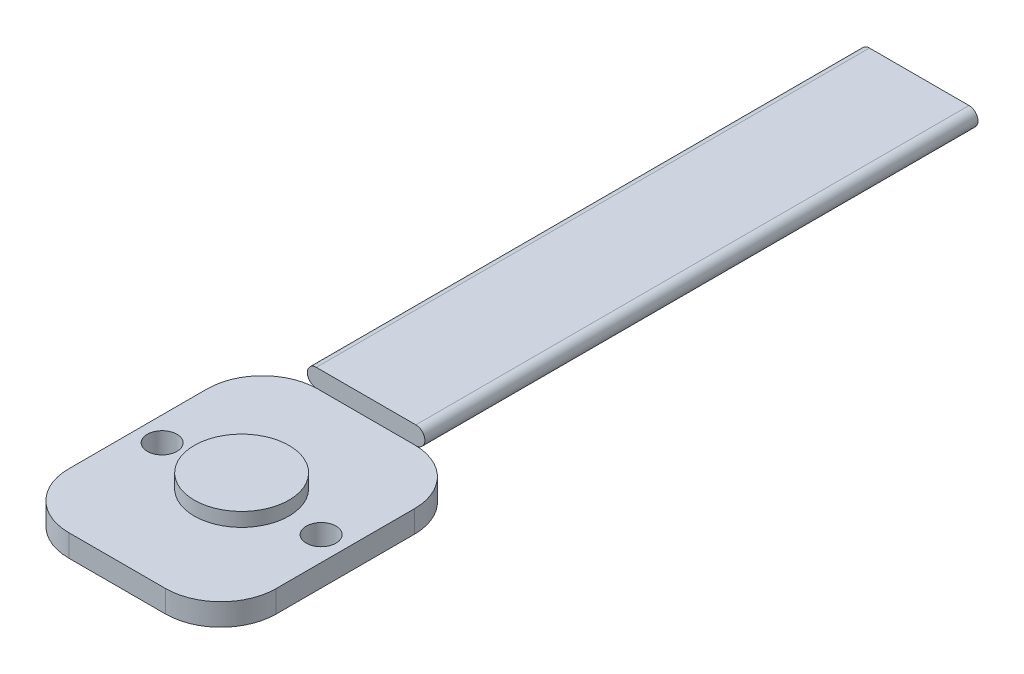
ISO-10303-21;
HEADER;
FILE_DESCRIPTION(('STEP AP214'),'2;1');
FILE_NAME('part.step','',(''),(''),'','','');
FILE_SCHEMA(('AUTOMOTIVE_DESIGN { 1 0 10303 214 1 1 1 1 }'));
ENDSEC;
DATA;
#1=APPLICATION_CONTEXT('core data for automotive mechanical design processes');
#2=APPLICATION_PROTOCOL_DEFINITION('international standard','automotive_design',2000,#1);
#3=PRODUCT_CONTEXT('',#1,'mechanical');
#4=PRODUCT('Part','Part','',(#3));
#5=PRODUCT_RELATED_PRODUCT_CATEGORY('part','',(#4));
#6=PRODUCT_DEFINITION_FORMATION('','',#4);
#7=PRODUCT_DEFINITION_CONTEXT('part definition',#1,'design');
#8=PRODUCT_DEFINITION('design','',#6,#7);
#9=PRODUCT_DEFINITION_SHAPE('','',#8);
#10=(LENGTH_UNIT() NAMED_UNIT(*) SI_UNIT(.MILLI.,.METRE.));
#11=(NAMED_UNIT(*) PLANE_ANGLE_UNIT() SI_UNIT($,.RADIAN.));
#12=(NAMED_UNIT(*) SI_UNIT($,.STERADIAN.) SOLID_ANGLE_UNIT());
#13=UNCERTAINTY_MEASURE_WITH_UNIT(LENGTH_MEASURE(1.E-05),#10,'distance_accuracy_value','');
#14=(GEOMETRIC_REPRESENTATION_CONTEXT(3) GLOBAL_UNCERTAINTY_ASSIGNED_CONTEXT((#13)) GLOBAL_UNIT_ASSIGNED_CONTEXT((#10,
#11,#12)) REPRESENTATION_CONTEXT('',''));
#15=CARTESIAN_POINT('',(0.,0.,0.));
#16=DIRECTION('',(0.,0.,1.));
#17=DIRECTION('',(1.,0.,0.));
#18=AXIS2_PLACEMENT_3D('',#15,#16,#17);
#19=CARTESIAN_POINT('',(-3.6,2.25,-49.));
#20=DIRECTION('',(0.,0.,1.));
#21=DIRECTION('',(1.,0.,0.));
#22=AXIS2_PLACEMENT_3D('',#19,#20,#21);
#23=CYLINDRICAL_SURFACE('',#22,0.65);
#24=CARTESIAN_POINT('',(-3.6,2.25,-9.));
#25=DIRECTION('',(0.,0.,-1.));
#26=DIRECTION('',(-1.,0.,0.));
#27=AXIS2_PLACEMENT_3D('',#24,#25,#26);
#28=CIRCLE('',#27,0.65);
#29=CARTESIAN_POINT('',(-3.6,1.6,-9.));
#30=VERTEX_POINT('',#29);
#31=CARTESIAN_POINT('',(-3.6,2.9,-9.));
#32=VERTEX_POINT('',#31);
#33=EDGE_CURVE('E112',#30,#32,#28,.T.);
#34=ORIENTED_EDGE('',*,*,#33,.T.);
#35=DIRECTION('',(0.,0.,1.));
#36=VECTOR('',#35,1.);
#37=CARTESIAN_POINT('',(-3.6,2.9,-49.));
#38=LINE('',#37,#36);
#39=CARTESIAN_POINT('',(-3.6,2.9,-49.));
#40=VERTEX_POINT('',#39);
#41=EDGE_CURVE('E12',#40,#32,#38,.T.);
#42=ORIENTED_EDGE('',*,*,#41,.F.);
#43=CARTESIAN_POINT('',(-3.6,2.25,-49.));
#44=DIRECTION('',(0.,0.,-1.));
#45=DIRECTION('',(-1.,0.,0.));
#46=AXIS2_PLACEMENT_3D('',#43,#44,#45);
#47=CIRCLE('',#46,0.65);
#48=CARTESIAN_POINT('',(-3.6,1.6,-49.));
#49=VERTEX_POINT('',#48);
#50=EDGE_CURVE('E100',#49,#40,#47,.T.);
#51=ORIENTED_EDGE('',*,*,#50,.F.);
#52=DIRECTION('',(0.,0.,1.));
#53=VECTOR('',#52,1.);
#54=CARTESIAN_POINT('',(-3.6,1.6,-49.));
#55=LINE('',#54,#53);
#56=EDGE_CURVE('E108',#49,#30,#55,.T.);
#57=ORIENTED_EDGE('',*,*,#56,.T.);
#58=EDGE_LOOP('',(#34,#42,#51,#57));
#59=FACE_BOUND('',#58,.T.);
#60=ADVANCED_FACE('F49',(#59),#23,.T.);
#61=CARTESIAN_POINT('',(-3.6,2.9,-49.));
#62=DIRECTION('',(0.,-1.,0.));
#63=DIRECTION('',(0.,0.,-1.));
#64=AXIS2_PLACEMENT_3D('',#61,#62,#63);
#65=PLANE('',#64);
#66=DIRECTION('',(1.,0.,0.));
#67=VECTOR('',#66,1.);
#68=CARTESIAN_POINT('',(-3.6,2.9,-9.));
#69=LINE('',#68,#67);
#70=CARTESIAN_POINT('',(3.6,2.9,-9.));
#71=VERTEX_POINT('',#70);
#72=EDGE_CURVE('E104',#32,#71,#69,.T.);
#73=ORIENTED_EDGE('',*,*,#72,.T.);
#74=DIRECTION('',(0.,0.,1.));
#75=VECTOR('',#74,1.);
#76=CARTESIAN_POINT('',(3.6,2.9,-49.));
#77=LINE('',#76,#75);
#78=CARTESIAN_POINT('',(3.6,2.9,-49.));
#79=VERTEX_POINT('',#78);
#80=EDGE_CURVE('E57',#79,#71,#77,.T.);
#81=ORIENTED_EDGE('',*,*,#80,.F.);
#82=DIRECTION('',(1.,0.,0.));
#83=VECTOR('',#82,1.);
#84=CARTESIAN_POINT('',(-3.6,2.9,-49.));
#85=LINE('',#84,#83);
#86=EDGE_CURVE('E95',#40,#79,#85,.T.);
#87=ORIENTED_EDGE('',*,*,#86,.F.);
#88=ORIENTED_EDGE('',*,*,#41,.T.);
#89=EDGE_LOOP('',(#73,#81,#87,#88));
#90=FACE_BOUND('',#89,.T.);
#91=ADVANCED_FACE('F103',(#90),#65,.F.);
#92=CARTESIAN_POINT('',(3.6,2.25,-49.));
#93=DIRECTION('',(0.,0.,1.));
#94=DIRECTION('',(1.,0.,0.));
#95=AXIS2_PLACEMENT_3D('',#92,#93,#94);
#96=CYLINDRICAL_SURFACE('',#95,0.65);
#97=CARTESIAN_POINT('',(3.6,2.25,-9.));
#98=DIRECTION('',(0.,0.,-1.));
#99=DIRECTION('',(-1.,0.,0.));
#100=AXIS2_PLACEMENT_3D('',#97,#98,#99);
#101=CIRCLE('',#100,0.65);
#102=CARTESIAN_POINT('',(3.6,1.6,-9.));
#103=VERTEX_POINT('',#102);
#104=EDGE_CURVE('E82',#71,#103,#101,.T.);
#105=ORIENTED_EDGE('',*,*,#104,.T.);
#106=DIRECTION('',(0.,0.,1.));
#107=VECTOR('',#106,1.);
#108=CARTESIAN_POINT('',(3.6,1.6,-49.));
#109=LINE('',#108,#107);
#110=CARTESIAN_POINT('',(3.6,1.6,-49.));
#111=VERTEX_POINT('',#110);
#112=EDGE_CURVE('E105',#111,#103,#109,.T.);
#113=ORIENTED_EDGE('',*,*,#112,.F.);
#114=CARTESIAN_POINT('',(3.6,2.25,-49.));
#115=DIRECTION('',(0.,0.,-1.));
#116=DIRECTION('',(-1.,0.,0.));
#117=AXIS2_PLACEMENT_3D('',#114,#115,#116);
#118=CIRCLE('',#117,0.65);
#119=EDGE_CURVE('E98',#79,#111,#118,.T.);
#120=ORIENTED_EDGE('',*,*,#119,.F.);
#121=ORIENTED_EDGE('',*,*,#80,.T.);
#122=EDGE_LOOP('',(#105,#113,#120,#121));
#123=FACE_BOUND('',#122,.T.);
#124=ADVANCED_FACE('F106',(#123),#96,.T.);
#125=CARTESIAN_POINT('',(-3.6,1.6,-49.));
#126=DIRECTION('',(0.,1.,0.));
#127=DIRECTION('',(0.,0.,1.));
#128=AXIS2_PLACEMENT_3D('',#125,#126,#127);
#129=PLANE('',#128);
#130=DIRECTION('',(-1.,0.,0.));
#131=VECTOR('',#130,1.);
#132=CARTESIAN_POINT('',(-3.6,1.6,-9.));
#133=LINE('',#132,#131);
#134=EDGE_CURVE('E88',#103,#30,#133,.T.);
#135=ORIENTED_EDGE('',*,*,#134,.T.);
#136=ORIENTED_EDGE('',*,*,#56,.F.);
#137=DIRECTION('',(-1.,0.,0.));
#138=VECTOR('',#137,1.);
#139=CARTESIAN_POINT('',(-3.6,1.6,-49.));
#140=LINE('',#139,#138);
#141=EDGE_CURVE('E65',#111,#49,#140,.T.);
#142=ORIENTED_EDGE('',*,*,#141,.F.);
#143=ORIENTED_EDGE('',*,*,#112,.T.);
#144=EDGE_LOOP('',(#135,#136,#142,#143));
#145=FACE_BOUND('',#144,.T.);
#146=ADVANCED_FACE('F119',(#145),#129,.F.);
#147=CARTESIAN_POINT('',(-3.6,2.25,-49.));
#148=DIRECTION('',(0.,0.,-1.));
#149=DIRECTION('',(-1.,0.,0.));
#150=AXIS2_PLACEMENT_3D('',#147,#148,#149);
#151=PLANE('',#150);
#152=ORIENTED_EDGE('',*,*,#50,.T.);
#153=ORIENTED_EDGE('',*,*,#86,.T.);
#154=ORIENTED_EDGE('',*,*,#119,.T.);
#155=ORIENTED_EDGE('',*,*,#141,.T.);
#156=EDGE_LOOP('',(#152,#153,#154,#155));
#157=FACE_BOUND('',#156,.T.);
#158=ADVANCED_FACE('F96',(#157),#151,.T.);
#159=CARTESIAN_POINT('',(-3.6,2.25,-9.));
#160=DIRECTION('',(0.,0.,-1.));
#161=DIRECTION('',(-1.,0.,0.));
#162=AXIS2_PLACEMENT_3D('',#159,#160,#161);
#163=PLANE('',#162);
#164=ORIENTED_EDGE('',*,*,#33,.F.);
#165=ORIENTED_EDGE('',*,*,#134,.F.);
#166=ORIENTED_EDGE('',*,*,#104,.F.);
#167=ORIENTED_EDGE('',*,*,#72,.F.);
#168=EDGE_LOOP('',(#164,#165,#166,#167));
#169=FACE_BOUND('',#168,.T.);
#170=ADVANCED_FACE('F122',(#169),#163,.F.);
#171=CLOSED_SHELL('',(#60,#91,#124,#146,#158,#170));
#172=MANIFOLD_SOLID_BREP('B2',#171);
#173=CARTESIAN_POINT('',(-3.5,1.6,5.));
#174=DIRECTION('',(0.,-1.,0.));
#175=DIRECTION('',(0.,0.,-1.));
#176=AXIS2_PLACEMENT_3D('',#173,#174,#175);
#177=PLANE('',#176);
#178=CARTESIAN_POINT('',(0.,1.6,0.));
#179=DIRECTION('',(0.,1.,0.));
#180=DIRECTION('',(0.,0.,1.));
#181=AXIS2_PLACEMENT_3D('',#178,#179,#180);
#182=CIRCLE('',#181,3.42647578680288);
#183=CARTESIAN_POINT('',(0.,1.6,3.42647578680288));
#184=VERTEX_POINT('',#183);
#185=EDGE_CURVE('E47',#184,#184,#182,.T.);
#186=ORIENTED_EDGE('',*,*,#185,.F.);
#187=EDGE_LOOP('',(#186));
#188=FACE_BOUND('',#187,.T.);
#189=CARTESIAN_POINT('',(-3.5,1.6,5.));
#190=DIRECTION('',(0.,1.,0.));
#191=DIRECTION('',(0.,0.,-1.));
#192=AXIS2_PLACEMENT_3D('',#189,#190,#191);
#193=CIRCLE('',#192,4.);
#194=CARTESIAN_POINT('',(-7.5,1.6,4.99999999999997));
#195=VERTEX_POINT('',#194);
#196=CARTESIAN_POINT('',(-3.49999999999997,1.6,9.));
#197=VERTEX_POINT('',#196);
#198=EDGE_CURVE('E299',#195,#197,#193,.T.);
#199=ORIENTED_EDGE('',*,*,#198,.T.);
#200=DIRECTION('',(1.,0.,0.));
#201=VECTOR('',#200,1.);
#202=CARTESIAN_POINT('',(3.49999999999997,1.6,9.));
#203=LINE('',#202,#201);
#204=CARTESIAN_POINT('',(3.49999999999997,1.6,9.));
#205=VERTEX_POINT('',#204);
#206=EDGE_CURVE('E247',#197,#205,#203,.T.);
#207=ORIENTED_EDGE('',*,*,#206,.T.);
#208=CARTESIAN_POINT('',(3.5,1.6,5.));
#209=DIRECTION('',(0.,1.,0.));
#210=DIRECTION('',(0.,0.,-1.));
#211=AXIS2_PLACEMENT_3D('',#208,#209,#210);
#212=CIRCLE('',#211,4.);
#213=CARTESIAN_POINT('',(7.5,1.6,4.99999999999997));
#214=VERTEX_POINT('',#213);
#215=EDGE_CURVE('E330',#205,#214,#212,.T.);
#216=ORIENTED_EDGE('',*,*,#215,.T.);
#217=DIRECTION('',(0.,0.,-1.));
#218=VECTOR('',#217,1.);
#219=CARTESIAN_POINT('',(7.5,1.6,-4.99999999999998));
#220=LINE('',#219,#218);
#221=CARTESIAN_POINT('',(7.5,1.6,-4.99999999999998));
#222=VERTEX_POINT('',#221);
#223=EDGE_CURVE('E329',#214,#222,#220,.T.);
#224=ORIENTED_EDGE('',*,*,#223,.T.);
#225=CARTESIAN_POINT('',(3.5,1.6,-5.));
#226=DIRECTION('',(0.,1.,0.));
#227=DIRECTION('',(0.,0.,1.));
#228=AXIS2_PLACEMENT_3D('',#225,#226,#227);
#229=CIRCLE('',#228,4.);
#230=CARTESIAN_POINT('',(3.49999999999997,1.6,-9.00000000000001));
#231=VERTEX_POINT('',#230);
#232=EDGE_CURVE('E266',#222,#231,#229,.T.);
#233=ORIENTED_EDGE('',*,*,#232,.T.);
#234=DIRECTION('',(-1.,0.,0.));
#235=VECTOR('',#234,1.);
#236=CARTESIAN_POINT('',(-3.49999999999997,1.6,-9.));
#237=LINE('',#236,#235);
#238=CARTESIAN_POINT('',(-3.49999999999997,1.6,-9.));
#239=VERTEX_POINT('',#238);
#240=EDGE_CURVE('E260',#231,#239,#237,.T.);
#241=ORIENTED_EDGE('',*,*,#240,.T.);
#242=CARTESIAN_POINT('',(-3.5,1.6,-5.));
#243=DIRECTION('',(0.,1.,0.));
#244=DIRECTION('',(0.,0.,1.));
#245=AXIS2_PLACEMENT_3D('',#242,#243,#244);
#246=CIRCLE('',#245,4.);
#247=CARTESIAN_POINT('',(-7.5,1.6,-4.99999999999998));
#248=VERTEX_POINT('',#247);
#249=EDGE_CURVE('E264',#239,#248,#246,.T.);
#250=ORIENTED_EDGE('',*,*,#249,.T.);
#251=DIRECTION('',(0.,0.,1.));
#252=VECTOR('',#251,1.);
#253=CARTESIAN_POINT('',(-7.5,1.6,4.99999999999997));
#254=LINE('',#253,#252);
#255=EDGE_CURVE('E203',#248,#195,#254,.T.);
#256=ORIENTED_EDGE('',*,*,#255,.T.);
#257=EDGE_LOOP('',(#199,#207,#216,#224,#233,#241,#250,#256));
#258=FACE_BOUND('',#257,.T.);
#259=CARTESIAN_POINT('',(-5.75,1.6,0.));
#260=DIRECTION('',(0.,1.,0.));
#261=DIRECTION('',(0.,0.,1.));
#262=AXIS2_PLACEMENT_3D('',#259,#260,#261);
#263=CIRCLE('',#262,1.075);
#264=CARTESIAN_POINT('',(-5.75,1.6,1.075));
#265=VERTEX_POINT('',#264);
#266=EDGE_CURVE('E288',#265,#265,#263,.T.);
#267=ORIENTED_EDGE('',*,*,#266,.F.);
#268=EDGE_LOOP('',(#267));
#269=FACE_BOUND('',#268,.T.);
#270=CARTESIAN_POINT('',(5.75,1.6,0.));
#271=DIRECTION('',(0.,1.,0.));
#272=DIRECTION('',(0.,0.,1.));
#273=AXIS2_PLACEMENT_3D('',#270,#271,#272);
#274=CIRCLE('',#273,1.075);
#275=CARTESIAN_POINT('',(5.75,1.6,1.075));
#276=VERTEX_POINT('',#275);
#277=EDGE_CURVE('E339',#276,#276,#274,.T.);
#278=ORIENTED_EDGE('',*,*,#277,.F.);
#279=EDGE_LOOP('',(#278));
#280=FACE_BOUND('',#279,.T.);
#281=ADVANCED_FACE('F185',(#188,#258,#269,#280),#177,.F.);
#282=CARTESIAN_POINT('',(-3.5,0.,5.));
#283=DIRECTION('',(0.,-1.,0.));
#284=DIRECTION('',(0.,0.,-1.));
#285=AXIS2_PLACEMENT_3D('',#282,#283,#284);
#286=PLANE('',#285);
#287=CARTESIAN_POINT('',(-5.75,0.,0.));
#288=DIRECTION('',(0.,1.,0.));
#289=DIRECTION('',(0.,0.,1.));
#290=AXIS2_PLACEMENT_3D('',#287,#288,#289);
#291=CIRCLE('',#290,1.075);
#292=CARTESIAN_POINT('',(-5.75,0.,1.075));
#293=VERTEX_POINT('',#292);
#294=EDGE_CURVE('E336',#293,#293,#291,.T.);
#295=ORIENTED_EDGE('',*,*,#294,.T.);
#296=EDGE_LOOP('',(#295));
#297=FACE_BOUND('',#296,.T.);
#298=CARTESIAN_POINT('',(-3.5,0.,5.));
#299=DIRECTION('',(0.,1.,0.));
#300=DIRECTION('',(0.,0.,-1.));
#301=AXIS2_PLACEMENT_3D('',#298,#299,#300);
#302=CIRCLE('',#301,4.);
#303=CARTESIAN_POINT('',(-7.5,0.,4.99999999999997));
#304=VERTEX_POINT('',#303);
#305=CARTESIAN_POINT('',(-3.49999999999997,0.,9.));
#306=VERTEX_POINT('',#305);
#307=EDGE_CURVE('E284',#304,#306,#302,.T.);
#308=ORIENTED_EDGE('',*,*,#307,.F.);
#309=DIRECTION('',(0.,0.,1.));
#310=VECTOR('',#309,1.);
#311=CARTESIAN_POINT('',(-7.5,0.,4.99999999999997));
#312=LINE('',#311,#310);
#313=CARTESIAN_POINT('',(-7.5,0.,-4.99999999999998));
#314=VERTEX_POINT('',#313);
#315=EDGE_CURVE('E238',#314,#304,#312,.T.);
#316=ORIENTED_EDGE('',*,*,#315,.F.);
#317=CARTESIAN_POINT('',(-3.5,0.,-5.));
#318=DIRECTION('',(0.,1.,0.));
#319=DIRECTION('',(0.,0.,1.));
#320=AXIS2_PLACEMENT_3D('',#317,#318,#319);
#321=CIRCLE('',#320,4.);
#322=CARTESIAN_POINT('',(-3.49999999999997,0.,-9.));
#323=VERTEX_POINT('',#322);
#324=EDGE_CURVE('E232',#323,#314,#321,.T.);
#325=ORIENTED_EDGE('',*,*,#324,.F.);
#326=DIRECTION('',(-1.,0.,0.));
#327=VECTOR('',#326,1.);
#328=CARTESIAN_POINT('',(-3.49999999999997,0.,-9.));
#329=LINE('',#328,#327);
#330=CARTESIAN_POINT('',(3.49999999999997,0.,-9.00000000000001));
#331=VERTEX_POINT('',#330);
#332=EDGE_CURVE('E274',#331,#323,#329,.T.);
#333=ORIENTED_EDGE('',*,*,#332,.F.);
#334=CARTESIAN_POINT('',(3.5,0.,-5.));
#335=DIRECTION('',(0.,1.,0.));
#336=DIRECTION('',(0.,0.,1.));
#337=AXIS2_PLACEMENT_3D('',#334,#335,#336);
#338=CIRCLE('',#337,4.);
#339=CARTESIAN_POINT('',(7.5,0.,-4.99999999999998));
#340=VERTEX_POINT('',#339);
#341=EDGE_CURVE('E294',#340,#331,#338,.T.);
#342=ORIENTED_EDGE('',*,*,#341,.F.);
#343=DIRECTION('',(0.,0.,-1.));
#344=VECTOR('',#343,1.);
#345=CARTESIAN_POINT('',(7.5,0.,-4.99999999999998));
#346=LINE('',#345,#344);
#347=CARTESIAN_POINT('',(7.5,0.,4.99999999999997));
#348=VERTEX_POINT('',#347);
#349=EDGE_CURVE('E292',#348,#340,#346,.T.);
#350=ORIENTED_EDGE('',*,*,#349,.F.);
#351=CARTESIAN_POINT('',(3.5,0.,5.));
#352=DIRECTION('',(0.,1.,0.));
#353=DIRECTION('',(0.,0.,-1.));
#354=AXIS2_PLACEMENT_3D('',#351,#352,#353);
#355=CIRCLE('',#354,4.);
#356=CARTESIAN_POINT('',(3.49999999999997,0.,9.));
#357=VERTEX_POINT('',#356);
#358=EDGE_CURVE('E290',#357,#348,#355,.T.);
#359=ORIENTED_EDGE('',*,*,#358,.F.);
#360=DIRECTION('',(1.,0.,0.));
#361=VECTOR('',#360,1.);
#362=CARTESIAN_POINT('',(3.49999999999997,0.,9.));
#363=LINE('',#362,#361);
#364=EDGE_CURVE('E287',#306,#357,#363,.T.);
#365=ORIENTED_EDGE('',*,*,#364,.F.);
#366=EDGE_LOOP('',(#308,#316,#325,#333,#342,#350,#359,#365));
#367=FACE_BOUND('',#366,.T.);
#368=CARTESIAN_POINT('',(5.75,0.,0.));
#369=DIRECTION('',(0.,1.,0.));
#370=DIRECTION('',(0.,0.,1.));
#371=AXIS2_PLACEMENT_3D('',#368,#369,#370);
#372=CIRCLE('',#371,1.075);
#373=CARTESIAN_POINT('',(5.75,0.,1.075));
#374=VERTEX_POINT('',#373);
#375=EDGE_CURVE('E342',#374,#374,#372,.T.);
#376=ORIENTED_EDGE('',*,*,#375,.T.);
#377=EDGE_LOOP('',(#376));
#378=FACE_BOUND('',#377,.T.);
#379=ADVANCED_FACE('F319',(#297,#367,#378),#286,.T.);
#380=CARTESIAN_POINT('',(-3.5,1.6,5.));
#381=DIRECTION('',(0.,-1.,0.));
#382=DIRECTION('',(0.,0.,-1.));
#383=AXIS2_PLACEMENT_3D('',#380,#381,#382);
#384=CYLINDRICAL_SURFACE('',#383,4.);
#385=ORIENTED_EDGE('',*,*,#307,.T.);
#386=DIRECTION('',(0.,-1.,0.));
#387=VECTOR('',#386,1.);
#388=CARTESIAN_POINT('',(-3.49999999999997,1.6,9.));
#389=LINE('',#388,#387);
#390=EDGE_CURVE('E189',#197,#306,#389,.T.);
#391=ORIENTED_EDGE('',*,*,#390,.F.);
#392=ORIENTED_EDGE('',*,*,#198,.F.);
#393=DIRECTION('',(0.,-1.,0.));
#394=VECTOR('',#393,1.);
#395=CARTESIAN_POINT('',(-7.5,1.6,4.99999999999997));
#396=LINE('',#395,#394);
#397=EDGE_CURVE('E280',#195,#304,#396,.T.);
#398=ORIENTED_EDGE('',*,*,#397,.T.);
#399=EDGE_LOOP('',(#385,#391,#392,#398));
#400=FACE_BOUND('',#399,.T.);
#401=ADVANCED_FACE('F187',(#400),#384,.T.);
#402=CARTESIAN_POINT('',(3.49999999999997,1.6,9.));
#403=DIRECTION('',(0.,0.,-1.));
#404=DIRECTION('',(-1.,0.,0.));
#405=AXIS2_PLACEMENT_3D('',#402,#403,#404);
#406=PLANE('',#405);
#407=ORIENTED_EDGE('',*,*,#364,.T.);
#408=DIRECTION('',(0.,-1.,0.));
#409=VECTOR('',#408,1.);
#410=CARTESIAN_POINT('',(3.49999999999997,1.6,9.));
#411=LINE('',#410,#409);
#412=EDGE_CURVE('E308',#205,#357,#411,.T.);
#413=ORIENTED_EDGE('',*,*,#412,.F.);
#414=ORIENTED_EDGE('',*,*,#206,.F.);
#415=ORIENTED_EDGE('',*,*,#390,.T.);
#416=EDGE_LOOP('',(#407,#413,#414,#415));
#417=FACE_BOUND('',#416,.T.);
#418=ADVANCED_FACE('F314',(#417),#406,.F.);
#419=CARTESIAN_POINT('',(3.5,1.6,5.));
#420=DIRECTION('',(0.,-1.,0.));
#421=DIRECTION('',(0.,0.,-1.));
#422=AXIS2_PLACEMENT_3D('',#419,#420,#421);
#423=CYLINDRICAL_SURFACE('',#422,4.);
#424=ORIENTED_EDGE('',*,*,#358,.T.);
#425=DIRECTION('',(0.,-1.,0.));
#426=VECTOR('',#425,1.);
#427=CARTESIAN_POINT('',(7.5,1.6,4.99999999999997));
#428=LINE('',#427,#426);
#429=EDGE_CURVE('E306',#214,#348,#428,.T.);
#430=ORIENTED_EDGE('',*,*,#429,.F.);
#431=ORIENTED_EDGE('',*,*,#215,.F.);
#432=ORIENTED_EDGE('',*,*,#412,.T.);
#433=EDGE_LOOP('',(#424,#430,#431,#432));
#434=FACE_BOUND('',#433,.T.);
#435=ADVANCED_FACE('F324',(#434),#423,.T.);
#436=CARTESIAN_POINT('',(7.5,1.6,-4.99999999999998));
#437=DIRECTION('',(-1.,0.,0.));
#438=DIRECTION('',(0.,0.,1.));
#439=AXIS2_PLACEMENT_3D('',#436,#437,#438);
#440=PLANE('',#439);
#441=ORIENTED_EDGE('',*,*,#349,.T.);
#442=DIRECTION('',(0.,-1.,0.));
#443=VECTOR('',#442,1.);
#444=CARTESIAN_POINT('',(7.5,1.6,-4.99999999999998));
#445=LINE('',#444,#443);
#446=EDGE_CURVE('E303',#222,#340,#445,.T.);
#447=ORIENTED_EDGE('',*,*,#446,.F.);
#448=ORIENTED_EDGE('',*,*,#223,.F.);
#449=ORIENTED_EDGE('',*,*,#429,.T.);
#450=EDGE_LOOP('',(#441,#447,#448,#449));
#451=FACE_BOUND('',#450,.T.);
#452=ADVANCED_FACE('F327',(#451),#440,.F.);
#453=CARTESIAN_POINT('',(3.5,1.6,-5.));
#454=DIRECTION('',(0.,-1.,0.));
#455=DIRECTION('',(0.,0.,-1.));
#456=AXIS2_PLACEMENT_3D('',#453,#454,#455);
#457=CYLINDRICAL_SURFACE('',#456,4.);
#458=ORIENTED_EDGE('',*,*,#341,.T.);
#459=DIRECTION('',(0.,-1.,0.));
#460=VECTOR('',#459,1.);
#461=CARTESIAN_POINT('',(3.49999999999997,1.6,-9.00000000000001));
#462=LINE('',#461,#460);
#463=EDGE_CURVE('E275',#231,#331,#462,.T.);
#464=ORIENTED_EDGE('',*,*,#463,.F.);
#465=ORIENTED_EDGE('',*,*,#232,.F.);
#466=ORIENTED_EDGE('',*,*,#446,.T.);
#467=EDGE_LOOP('',(#458,#464,#465,#466));
#468=FACE_BOUND('',#467,.T.);
#469=ADVANCED_FACE('F378',(#468),#457,.T.);
#470=CARTESIAN_POINT('',(-3.49999999999997,1.6,-9.));
#471=DIRECTION('',(0.,0.,1.));
#472=DIRECTION('',(1.,0.,0.));
#473=AXIS2_PLACEMENT_3D('',#470,#471,#472);
#474=PLANE('',#473);
#475=ORIENTED_EDGE('',*,*,#332,.T.);
#476=DIRECTION('',(0.,-1.,0.));
#477=VECTOR('',#476,1.);
#478=CARTESIAN_POINT('',(-3.49999999999997,1.6,-9.));
#479=LINE('',#478,#477);
#480=EDGE_CURVE('E271',#239,#323,#479,.T.);
#481=ORIENTED_EDGE('',*,*,#480,.F.);
#482=ORIENTED_EDGE('',*,*,#240,.F.);
#483=ORIENTED_EDGE('',*,*,#463,.T.);
#484=EDGE_LOOP('',(#475,#481,#482,#483));
#485=FACE_BOUND('',#484,.T.);
#486=ADVANCED_FACE('F272',(#485),#474,.F.);
#487=CARTESIAN_POINT('',(-3.5,1.6,-5.));
#488=DIRECTION('',(0.,-1.,0.));
#489=DIRECTION('',(0.,0.,-1.));
#490=AXIS2_PLACEMENT_3D('',#487,#488,#489);
#491=CYLINDRICAL_SURFACE('',#490,4.);
#492=ORIENTED_EDGE('',*,*,#324,.T.);
#493=DIRECTION('',(0.,-1.,0.));
#494=VECTOR('',#493,1.);
#495=CARTESIAN_POINT('',(-7.5,1.6,-4.99999999999998));
#496=LINE('',#495,#494);
#497=EDGE_CURVE('E276',#248,#314,#496,.T.);
#498=ORIENTED_EDGE('',*,*,#497,.F.);
#499=ORIENTED_EDGE('',*,*,#249,.F.);
#500=ORIENTED_EDGE('',*,*,#480,.T.);
#501=EDGE_LOOP('',(#492,#498,#499,#500));
#502=FACE_BOUND('',#501,.T.);
#503=ADVANCED_FACE('F278',(#502),#491,.T.);
#504=CARTESIAN_POINT('',(-7.5,1.6,4.99999999999997));
#505=DIRECTION('',(1.,0.,0.));
#506=DIRECTION('',(0.,0.,-1.));
#507=AXIS2_PLACEMENT_3D('',#504,#505,#506);
#508=PLANE('',#507);
#509=ORIENTED_EDGE('',*,*,#315,.T.);
#510=ORIENTED_EDGE('',*,*,#397,.F.);
#511=ORIENTED_EDGE('',*,*,#255,.F.);
#512=ORIENTED_EDGE('',*,*,#497,.T.);
#513=EDGE_LOOP('',(#509,#510,#511,#512));
#514=FACE_BOUND('',#513,.T.);
#515=ADVANCED_FACE('F371',(#514),#508,.F.);
#516=CARTESIAN_POINT('',(-5.75,1.6,0.));
#517=DIRECTION('',(0.,-1.,0.));
#518=DIRECTION('',(0.,0.,-1.));
#519=AXIS2_PLACEMENT_3D('',#516,#517,#518);
#520=CYLINDRICAL_SURFACE('',#519,1.075);
#521=ORIENTED_EDGE('',*,*,#266,.T.);
#522=EDGE_LOOP('',(#521));
#523=FACE_BOUND('',#522,.T.);
#524=ORIENTED_EDGE('',*,*,#294,.F.);
#525=EDGE_LOOP('',(#524));
#526=FACE_BOUND('',#525,.T.);
#527=ADVANCED_FACE('F368',(#523,#526),#520,.F.);
#528=CARTESIAN_POINT('',(5.75,1.6,0.));
#529=DIRECTION('',(0.,-1.,0.));
#530=DIRECTION('',(0.,0.,-1.));
#531=AXIS2_PLACEMENT_3D('',#528,#529,#530);
#532=CYLINDRICAL_SURFACE('',#531,1.075);
#533=ORIENTED_EDGE('',*,*,#277,.T.);
#534=EDGE_LOOP('',(#533));
#535=FACE_BOUND('',#534,.T.);
#536=ORIENTED_EDGE('',*,*,#375,.F.);
#537=EDGE_LOOP('',(#536));
#538=FACE_BOUND('',#537,.T.);
#539=ADVANCED_FACE('F356',(#535,#538),#532,.F.);
#540=CARTESIAN_POINT('',(0.,2.6,0.));
#541=DIRECTION('',(0.,-1.,0.));
#542=DIRECTION('',(0.,0.,-1.));
#543=AXIS2_PLACEMENT_3D('',#540,#541,#542);
#544=CYLINDRICAL_SURFACE('',#543,3.42647578680288);
#545=CARTESIAN_POINT('',(0.,2.6,0.));
#546=DIRECTION('',(0.,1.,0.));
#547=DIRECTION('',(0.,0.,1.));
#548=AXIS2_PLACEMENT_3D('',#545,#546,#547);
#549=CIRCLE('',#548,3.42647578680288);
#550=CARTESIAN_POINT('',(0.,2.6,3.42647578680288));
#551=VERTEX_POINT('',#550);
#552=EDGE_CURVE('E345',#551,#551,#549,.T.);
#553=ORIENTED_EDGE('',*,*,#552,.F.);
#554=EDGE_LOOP('',(#553));
#555=FACE_BOUND('',#554,.T.);
#556=ORIENTED_EDGE('',*,*,#185,.T.);
#557=EDGE_LOOP('',(#556));
#558=FACE_BOUND('',#557,.T.);
#559=ADVANCED_FACE('F353',(#555,#558),#544,.T.);
#560=CARTESIAN_POINT('',(0.,2.6,0.));
#561=DIRECTION('',(0.,1.,0.));
#562=DIRECTION('',(0.,0.,1.));
#563=AXIS2_PLACEMENT_3D('',#560,#561,#562);
#564=PLANE('',#563);
#565=ORIENTED_EDGE('',*,*,#552,.T.);
#566=EDGE_LOOP('',(#565));
#567=FACE_BOUND('',#566,.T.);
#568=ADVANCED_FACE('F351',(#567),#564,.T.);
#569=CLOSED_SHELL('',(#281,#379,#401,#418,#435,#452,#469,#486,#503,#515,#527,#539,#559,#568));
#570=MANIFOLD_SOLID_BREP('B6',#569);
#571=ADVANCED_BREP_SHAPE_REPRESENTATION('',(#18,#172,#570),#14);
#572=SHAPE_DEFINITION_REPRESENTATION(#9,#571);
ENDSEC;
END-ISO-10303-21;
